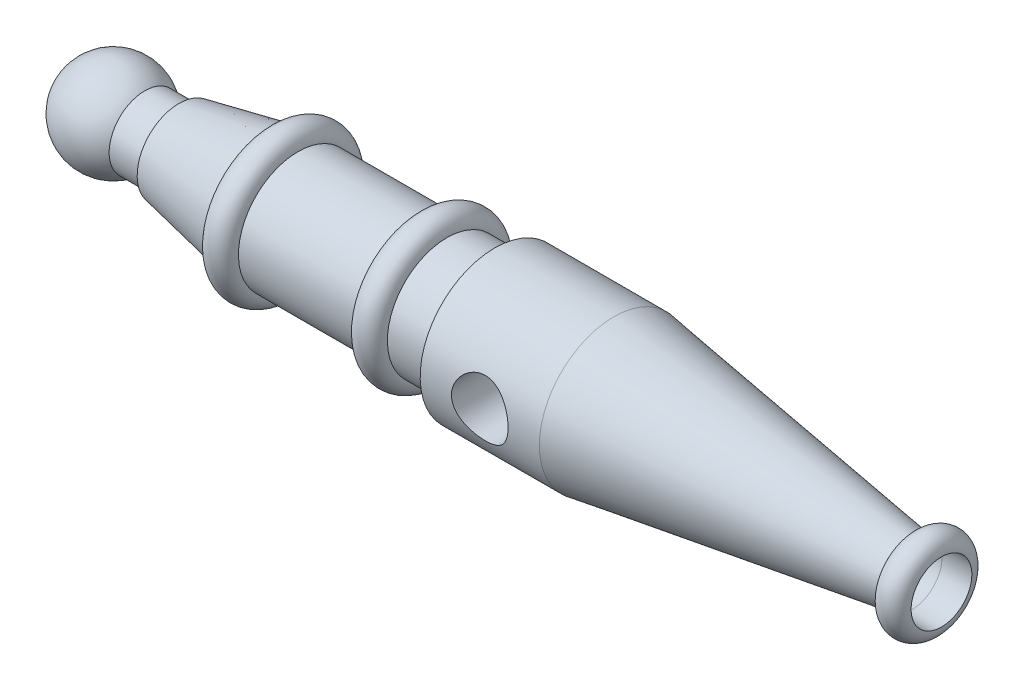
ISO-10303-21;
HEADER;
FILE_DESCRIPTION(('STEP AP214'),'2;1');
FILE_NAME('part.step','',(''),(''),'','','');
FILE_SCHEMA(('AUTOMOTIVE_DESIGN { 1 0 10303 214 1 1 1 1 }'));
ENDSEC;
DATA;
#1=APPLICATION_CONTEXT('core data for automotive mechanical design processes');
#2=APPLICATION_PROTOCOL_DEFINITION('international standard','automotive_design',2000,#1);
#3=PRODUCT_CONTEXT('',#1,'mechanical');
#4=PRODUCT('Part','Part','',(#3));
#5=PRODUCT_RELATED_PRODUCT_CATEGORY('part','',(#4));
#6=PRODUCT_DEFINITION_FORMATION('','',#4);
#7=PRODUCT_DEFINITION_CONTEXT('part definition',#1,'design');
#8=PRODUCT_DEFINITION('design','',#6,#7);
#9=PRODUCT_DEFINITION_SHAPE('','',#8);
#10=(LENGTH_UNIT() NAMED_UNIT(*) SI_UNIT(.MILLI.,.METRE.));
#11=(NAMED_UNIT(*) PLANE_ANGLE_UNIT() SI_UNIT($,.RADIAN.));
#12=(NAMED_UNIT(*) SI_UNIT($,.STERADIAN.) SOLID_ANGLE_UNIT());
#13=UNCERTAINTY_MEASURE_WITH_UNIT(LENGTH_MEASURE(1.E-05),#10,'distance_accuracy_value','');
#14=(GEOMETRIC_REPRESENTATION_CONTEXT(3) GLOBAL_UNCERTAINTY_ASSIGNED_CONTEXT((#13)) GLOBAL_UNIT_ASSIGNED_CONTEXT((#10,
#11,#12)) REPRESENTATION_CONTEXT('',''));
#15=CARTESIAN_POINT('',(0.,0.,0.));
#16=DIRECTION('',(0.,0.,1.));
#17=DIRECTION('',(1.,0.,0.));
#18=AXIS2_PLACEMENT_3D('',#15,#16,#17);
#19=CARTESIAN_POINT('',(84.,0.,0.));
#20=DIRECTION('',(-1.,0.,0.));
#21=DIRECTION('',(0.,-1.,0.));
#22=AXIS2_PLACEMENT_3D('',#19,#20,#21);
#23=CONICAL_SURFACE('',#22,12.5,0.147006349696604);
#24=CARTESIAN_POINT('',(134.,0.,0.));
#25=DIRECTION('',(-1.,0.,0.));
#26=DIRECTION('',(0.,-1.,0.));
#27=AXIS2_PLACEMENT_3D('',#24,#25,#26);
#28=CIRCLE('',#27,5.09627185653209);
#29=CARTESIAN_POINT('',(134.,-5.09627185653208,0.));
#30=VERTEX_POINT('',#29);
#31=EDGE_CURVE('E45',#30,#30,#28,.T.);
#32=ORIENTED_EDGE('',*,*,#31,.T.);
#33=EDGE_LOOP('',(#32));
#34=FACE_BOUND('',#33,.T.);
#35=CARTESIAN_POINT('',(84.,0.,0.));
#36=DIRECTION('',(1.,0.,0.));
#37=DIRECTION('',(0.,1.,0.));
#38=AXIS2_PLACEMENT_3D('',#35,#36,#37);
#39=CIRCLE('',#38,12.5);
#40=CARTESIAN_POINT('',(84.,12.5,0.));
#41=VERTEX_POINT('',#40);
#42=EDGE_CURVE('E80',#41,#41,#39,.T.);
#43=ORIENTED_EDGE('',*,*,#42,.T.);
#44=EDGE_LOOP('',(#43));
#45=FACE_BOUND('',#44,.T.);
#46=ADVANCED_FACE('F41',(#34,#45),#23,.T.);
#47=CARTESIAN_POINT('',(84.,0.,0.));
#48=DIRECTION('',(1.,0.,0.));
#49=DIRECTION('',(0.,1.,0.));
#50=AXIS2_PLACEMENT_3D('',#47,#48,#49);
#51=CYLINDRICAL_SURFACE('',#50,12.5);
#52=CARTESIAN_POINT('',(78.75,0.,-12.5));
#53=CARTESIAN_POINT('',(78.7500006745767,0.128466446938818,-12.5000005012393));
#54=CARTESIAN_POINT('',(78.7447843835891,0.256923646186465,-12.4980153397341));
#55=CARTESIAN_POINT('',(78.7239718683116,0.512917273918689,-12.4901287481548));
#56=CARTESIAN_POINT('',(78.7083723830663,0.640453400406382,-12.4842260877492));
#57=CARTESIAN_POINT('',(78.6669592815581,0.893546659172996,-12.4686664063571));
#58=CARTESIAN_POINT('',(78.6411513793594,1.0191048577656,-12.4590114857153));
#59=CARTESIAN_POINT('',(78.5795624724585,1.26747251190663,-12.436200181148));
#60=CARTESIAN_POINT('',(78.5437775905132,1.39028087873356,-12.4230424360485));
#61=CARTESIAN_POINT('',(78.4626581879778,1.63198891229308,-12.3936028937675));
#62=CARTESIAN_POINT('',(78.4173466965652,1.75089721971283,-12.3773286386007));
#63=CARTESIAN_POINT('',(78.3175104462981,1.98437662723286,-12.3420509918013));
#64=CARTESIAN_POINT('',(78.2629822702312,2.09894609929436,-12.3230465883222));
#65=CARTESIAN_POINT('',(78.0861906067839,2.4350590912118,-12.2626315047553));
#66=CARTESIAN_POINT('',(77.9506576283446,2.64919164725329,-12.2177954028037));
#67=CARTESIAN_POINT('',(77.6421647180935,3.0603754853248,-12.1214921926306));
#68=CARTESIAN_POINT('',(77.4679471463297,3.25642969187667,-12.0698341891123));
#69=CARTESIAN_POINT('',(77.0894811240755,3.61744362733619,-11.9665936986651));
#70=CARTESIAN_POINT('',(76.8852231561552,3.78239346378753,-11.9150112409209));
#71=CARTESIAN_POINT('',(76.5557982258525,4.006122592458,-11.8409250924736));
#72=CARTESIAN_POINT('',(76.4396984035638,4.07787277388982,-11.8163429144165));
#73=CARTESIAN_POINT('',(76.2014169807964,4.2112796562967,-11.7694568811461));
#74=CARTESIAN_POINT('',(76.079237849611,4.27294041244834,-11.7471521119508));
#75=CARTESIAN_POINT('',(75.8295746229439,4.38564983408058,-11.7055410175444));
#76=CARTESIAN_POINT('',(75.7020899500244,4.43669734080586,-11.6862350197976));
#77=CARTESIAN_POINT('',(75.4427815715623,4.52766449495391,-11.6512930601117));
#78=CARTESIAN_POINT('',(75.310960009087,4.56758954884961,-11.6356553156706));
#79=CARTESIAN_POINT('',(75.0494765379652,4.63449564115211,-11.6091641155722));
#80=CARTESIAN_POINT('',(74.9199517483766,4.66194478254551,-11.5981391572528));
#81=CARTESIAN_POINT('',(74.6588287577836,4.70594997128014,-11.5803540613601));
#82=CARTESIAN_POINT('',(74.5272314953245,4.72251081207375,-11.5735920471276));
#83=CARTESIAN_POINT('',(74.262979690917,4.74456721028894,-11.5645676402429));
#84=CARTESIAN_POINT('',(74.1303253224157,4.75006454691984,-11.5623045240883));
#85=CARTESIAN_POINT('',(73.8650258459362,4.74993431563228,-11.5623581029648));
#86=CARTESIAN_POINT('',(73.7323807378003,4.74430719556799,-11.5646746136269));
#87=CARTESIAN_POINT('',(73.4763796883632,4.72268848101096,-11.5735187896225));
#88=CARTESIAN_POINT('',(73.3529576417081,4.70736101442424,-11.5797764994281));
#89=CARTESIAN_POINT('',(73.1078970676873,4.6671273330671,-11.5960507398756));
#90=CARTESIAN_POINT('',(72.9862591456169,4.64221794208398,-11.6060685168763));
#91=CARTESIAN_POINT('',(72.7456470495574,4.58305985841392,-11.6295560605714));
#92=CARTESIAN_POINT('',(72.6266722011896,4.54881355976924,-11.6430249423274));
#93=CARTESIAN_POINT('',(72.3920841325886,4.47128545414174,-11.6730170411612));
#94=CARTESIAN_POINT('',(72.2764722230428,4.42800017662868,-11.6895414311263));
#95=CARTESIAN_POINT('',(71.9314541139855,4.28327874939258,-11.7436925243237));
#96=CARTESIAN_POINT('',(71.7082918670552,4.16806851082152,-11.7854405393756));
#97=CARTESIAN_POINT('',(71.2838281709439,3.90479581255148,-11.8752623575038));
#98=CARTESIAN_POINT('',(71.0825344474763,3.75672179858853,-11.9233383829602));
#99=CARTESIAN_POINT('',(70.6927138522058,3.41982015890275,-12.0244668564206));
#100=CARTESIAN_POINT('',(70.5060327032103,3.22888228789724,-12.0776335228233));
#101=CARTESIAN_POINT('',(70.1667922113442,2.81781145947519,-12.1800970946688));
#102=CARTESIAN_POINT('',(70.0142383979542,2.59767378015139,-12.2293933721733));
#103=CARTESIAN_POINT('',(69.7454580617157,2.12963147248242,-12.3195902543165));
#104=CARTESIAN_POINT('',(69.6298625315132,1.88133356641682,-12.360341317423));
#105=CARTESIAN_POINT('',(69.442701821219,1.36688022548378,-12.4277426608653));
#106=CARTESIAN_POINT('',(69.3711165380134,1.10073300558123,-12.4543993784726));
#107=CARTESIAN_POINT('',(69.2775963116468,0.573677479246099,-12.4894688884553));
#108=CARTESIAN_POINT('',(69.2531737134772,0.313270964982971,-12.4987947222216));
#109=CARTESIAN_POINT('',(69.2474089314548,-0.208057225351649,-12.5009838786683));
#110=CARTESIAN_POINT('',(69.2660568894794,-0.468978769883661,-12.4938509684776));
#111=CARTESIAN_POINT('',(69.3440243104945,-0.973077936956711,-12.4645257652524));
#112=CARTESIAN_POINT('',(69.4017007849381,-1.21654883204224,-12.4429421784921));
#113=CARTESIAN_POINT('',(69.5539115340806,-1.69017638420405,-12.38750180738));
#114=CARTESIAN_POINT('',(69.6484505969315,-1.92033130718158,-12.3536434286722));
#115=CARTESIAN_POINT('',(69.8747333967106,-2.36845004238711,-12.2757374233217));
#116=CARTESIAN_POINT('',(70.0074976777157,-2.58584961467165,-12.2314173121275));
#117=CARTESIAN_POINT('',(70.305325876665,-2.99602447185312,-12.137470264806));
#118=CARTESIAN_POINT('',(70.4704019401065,-3.18879045219183,-12.0878413363678));
#119=CARTESIAN_POINT('',(70.8396876375161,-3.55623210606137,-11.985064504796));
#120=CARTESIAN_POINT('',(71.045643205594,-3.72914496745584,-11.9318831544933));
#121=CARTESIAN_POINT('',(71.4848323542859,-4.03837087571106,-11.8308123502666));
#122=CARTESIAN_POINT('',(71.7180687431341,-4.17468014990191,-11.7829234421247));
#123=CARTESIAN_POINT('',(72.0843584962984,-4.34871299636099,-11.7193224978098));
#124=CARTESIAN_POINT('',(72.2096141625501,-4.40177044148724,-11.6994448738917));
#125=CARTESIAN_POINT('',(72.4646408130254,-4.49707330691068,-11.6631444504838));
#126=CARTESIAN_POINT('',(72.5944098412718,-4.53932334614442,-11.6467201756163));
#127=CARTESIAN_POINT('',(72.8574751261568,-4.61256770312462,-11.6179072708148));
#128=CARTESIAN_POINT('',(72.9907702460197,-4.64356560212121,-11.6055173569829));
#129=CARTESIAN_POINT('',(73.2598696831389,-4.69397900786603,-11.5852191698974));
#130=CARTESIAN_POINT('',(73.3956738180134,-4.71339535309548,-11.5773105722075));
#131=CARTESIAN_POINT('',(73.6596283033566,-4.73952098873368,-11.5666383982182));
#132=CARTESIAN_POINT('',(73.7876922426723,-4.74698436529658,-11.5635697011122));
#133=CARTESIAN_POINT('',(74.0440815536004,-4.75152604134758,-11.5617043526346));
#134=CARTESIAN_POINT('',(74.1724069987481,-4.74860084160406,-11.5629091407203));
#135=CARTESIAN_POINT('',(74.4282282305541,-4.73239263611602,-11.5695520918507));
#136=CARTESIAN_POINT('',(74.5557243830436,-4.71911456118938,-11.5749882396016));
#137=CARTESIAN_POINT('',(74.8090399859767,-4.68234374170502,-11.5899115396728));
#138=CARTESIAN_POINT('',(74.9348587865039,-4.65884714995236,-11.5994002177163));
#139=CARTESIAN_POINT('',(75.1798053115603,-4.60280569614165,-11.6217493591521));
#140=CARTESIAN_POINT('',(75.299017378433,-4.57058127757041,-11.6344896300873));
#141=CARTESIAN_POINT('',(75.534248793183,-4.49708671459059,-11.6630938751032));
#142=CARTESIAN_POINT('',(75.6502670081751,-4.45581340583947,-11.6789589417085));
#143=CARTESIAN_POINT('',(75.9924346145225,-4.31890542711458,-11.7305847438557));
#144=CARTESIAN_POINT('',(76.2128785805009,-4.21014074671157,-11.7703937023547));
#145=CARTESIAN_POINT('',(76.6445743867865,-3.95413108187677,-11.8589251576371));
#146=CARTESIAN_POINT('',(76.8547060532189,-3.80514081966397,-11.9080102201227));
#147=CARTESIAN_POINT('',(77.248057372147,-3.47540026707773,-12.0083800053119));
#148=CARTESIAN_POINT('',(77.431268320488,-3.29463974587397,-12.0596654325553));
#149=CARTESIAN_POINT('',(77.6872930924983,-2.99746860333468,-12.1357522409645));
#150=CARTESIAN_POINT('',(77.7714389736465,-2.89088551968472,-12.1616429270626));
#151=CARTESIAN_POINT('',(77.9304435680941,-2.67067948767236,-12.2118876888598));
#152=CARTESIAN_POINT('',(78.0053056656052,-2.55705912738512,-12.2362423228947));
#153=CARTESIAN_POINT('',(78.1452156714933,-2.32341236076622,-12.2827502759549));
#154=CARTESIAN_POINT('',(78.2102579035981,-2.20338230322347,-12.304902319289));
#155=CARTESIAN_POINT('',(78.3299079557418,-1.95781549313792,-12.3463538942416));
#156=CARTESIAN_POINT('',(78.3845201733574,-1.83228108895005,-12.3656546272692));
#157=CARTESIAN_POINT('',(78.4855532510238,-1.5694617753102,-12.4018279997747));
#158=CARTESIAN_POINT('',(78.5313540440669,-1.43191096979924,-12.4185073179799));
#159=CARTESIAN_POINT('',(78.6102604457606,-1.15282973759642,-12.4475159966159));
#160=CARTESIAN_POINT('',(78.6433716686955,-1.01130110064607,-12.459847280567));
#161=CARTESIAN_POINT('',(78.6965160686768,-0.725505468548199,-12.4797498090044));
#162=CARTESIAN_POINT('',(78.7165518483098,-0.58123902423101,-12.4873220007477));
#163=CARTESIAN_POINT('',(78.743292574796,-0.291310969774446,-12.4974464894756));
#164=CARTESIAN_POINT('',(78.749999235195,-0.145649541388967,-12.4999994317171));
#165=CARTESIAN_POINT('',(78.75,0.,-12.5));
#166=B_SPLINE_CURVE_WITH_KNOTS('',3,(#52,#53,#54,#55,#56,#57,#58,#59,#60,#61,#62,#63,#64,#65,
#66,#67,#68,#69,#70,#71,#72,#73,#74,#75,#76,#77,#78,#79,#80,#81,#82,#83,#84,#85,#86,#87,#88,#89,
#90,#91,#92,#93,#94,#95,#96,#97,#98,#99,#100,#101,#102,#103,#104,#105,#106,#107,#108,#109,#110,
#111,#112,#113,#114,#115,#116,#117,#118,#119,#120,#121,#122,#123,#124,#125,#126,#127,#128,#129,
#130,#131,#132,#133,#134,#135,#136,#137,#138,#139,#140,#141,#142,#143,#144,#145,#146,#147,#148,
#149,#150,#151,#152,#153,#154,#155,#156,#157,#158,#159,#160,#161,#162,#163,#164,#165),
.UNSPECIFIED.,.T.,.F.,(4,2,2,2,2,2,2,2,2,2,2,2,2,2,2,2,2,2,2,2,2,2,2,2,2,2,2,2,2,2,2,2,2,2,2,2,
2,2,2,2,2,2,2,2,2,2,2,2,2,2,2,2,2,2,2,2,4),(0.,0.385262777799974,0.770646608705619,
1.15581502924361,1.54113334265699,1.92553070033719,2.31007089250849,3.07856982350731,
3.87715861657319,4.67600096659892,5.09160537368291,5.50704232710943,5.92252461418106,
6.33780458716929,6.73586392525797,7.13374790463234,7.53156789203284,7.92937186411553,
8.30251559168308,8.67578311552742,9.04895502107775,9.42227047088334,10.1824862468386,
10.9429697244626,11.7560474568173,12.5692568328079,13.3956885513754,14.221742489313,
15.0028882340516,15.7838552054488,16.5338374469207,17.2839171374857,18.0562494365395,
18.8288726027406,19.6475421200437,20.4662959838729,20.8782711750289,21.2900699983605,
21.7017376421742,22.1133754784596,22.4978452931976,22.8824446229407,23.2668608893628,
23.6514220110902,24.0234283181465,24.3955649216571,25.139282934915,25.922731508458,
26.706432836138,27.1207428294027,27.5349013477699,27.9492983570997,28.3635202578182,
28.8006508375199,29.2375877923427,29.6744377510004,30.1112315460957),.UNSPECIFIED.);
#167=CARTESIAN_POINT('',(78.75,0.,-12.5));
#168=VERTEX_POINT('',#167);
#169=EDGE_CURVE('E83',#168,#168,#166,.T.);
#170=ORIENTED_EDGE('',*,*,#169,.T.);
#171=EDGE_LOOP('',(#170));
#172=FACE_BOUND('',#171,.T.);
#173=CARTESIAN_POINT('',(78.75,0.,12.5));
#174=CARTESIAN_POINT('',(78.7500006745767,-0.128466446938811,12.5000005012394));
#175=CARTESIAN_POINT('',(78.7447843835891,-0.256923646186459,12.4980153397341));
#176=CARTESIAN_POINT('',(78.7239718683116,-0.512917273918683,12.4901287481548));
#177=CARTESIAN_POINT('',(78.7083723830663,-0.640453400406376,12.4842260877492));
#178=CARTESIAN_POINT('',(78.6669592815581,-0.893546659172991,12.4686664063571));
#179=CARTESIAN_POINT('',(78.6411513793594,-1.0191048577656,12.4590114857153));
#180=CARTESIAN_POINT('',(78.5795624724585,-1.26747251190662,12.436200181148));
#181=CARTESIAN_POINT('',(78.5437775905132,-1.39028087873355,12.4230424360485));
#182=CARTESIAN_POINT('',(78.4626581879778,-1.63198891229307,12.3936028937675));
#183=CARTESIAN_POINT('',(78.4173466965652,-1.75089721971283,12.3773286386007));
#184=CARTESIAN_POINT('',(78.3175104462981,-1.98437662723285,12.3420509918013));
#185=CARTESIAN_POINT('',(78.2629822702312,-2.09894609929436,12.3230465883222));
#186=CARTESIAN_POINT('',(78.0861906067839,-2.4350590912118,12.2626315047553));
#187=CARTESIAN_POINT('',(77.9506576283446,-2.64919164725328,12.2177954028037));
#188=CARTESIAN_POINT('',(77.6421647180935,-3.06037548532479,12.1214921926306));
#189=CARTESIAN_POINT('',(77.4679471463297,-3.25642969187666,12.0698341891123));
#190=CARTESIAN_POINT('',(77.0894811240755,-3.61744362733618,11.9665936986651));
#191=CARTESIAN_POINT('',(76.8852231561552,-3.78239346378752,11.9150112409209));
#192=CARTESIAN_POINT('',(76.5557982258525,-4.006122592458,11.8409250924736));
#193=CARTESIAN_POINT('',(76.4396984035639,-4.07787277388981,11.8163429144165));
#194=CARTESIAN_POINT('',(76.2014169807964,-4.2112796562967,11.7694568811461));
#195=CARTESIAN_POINT('',(76.079237849611,-4.27294041244833,11.7471521119508));
#196=CARTESIAN_POINT('',(75.8295746229439,-4.38564983408058,11.7055410175444));
#197=CARTESIAN_POINT('',(75.7020899500244,-4.43669734080586,11.6862350197976));
#198=CARTESIAN_POINT('',(75.4427815715623,-4.52766449495391,11.6512930601117));
#199=CARTESIAN_POINT('',(75.310960009087,-4.56758954884961,11.6356553156706));
#200=CARTESIAN_POINT('',(75.0494765379652,-4.63449564115211,11.6091641155722));
#201=CARTESIAN_POINT('',(74.9199517483766,-4.6619447825455,11.5981391572528));
#202=CARTESIAN_POINT('',(74.6588287577836,-4.70594997128014,11.5803540613601));
#203=CARTESIAN_POINT('',(74.5272314953245,-4.72251081207375,11.5735920471276));
#204=CARTESIAN_POINT('',(74.262979690917,-4.74456721028894,11.5645676402429));
#205=CARTESIAN_POINT('',(74.1303253224157,-4.75006454691983,11.5623045240883));
#206=CARTESIAN_POINT('',(73.8650258459362,-4.74993431563228,11.5623581029648));
#207=CARTESIAN_POINT('',(73.7323807378003,-4.74430719556798,11.5646746136269));
#208=CARTESIAN_POINT('',(73.4763796883632,-4.72268848101095,11.5735187896225));
#209=CARTESIAN_POINT('',(73.3529576417081,-4.70736101442424,11.5797764994281));
#210=CARTESIAN_POINT('',(73.1078970676873,-4.6671273330671,11.5960507398756));
#211=CARTESIAN_POINT('',(72.9862591456169,-4.64221794208398,11.6060685168763));
#212=CARTESIAN_POINT('',(72.7456470495574,-4.58305985841391,11.6295560605714));
#213=CARTESIAN_POINT('',(72.6266722011896,-4.54881355976923,11.6430249423274));
#214=CARTESIAN_POINT('',(72.3920841325886,-4.47128545414173,11.6730170411612));
#215=CARTESIAN_POINT('',(72.2764722230428,-4.42800017662868,11.6895414311263));
#216=CARTESIAN_POINT('',(71.9314541139855,-4.28327874939258,11.7436925243237));
#217=CARTESIAN_POINT('',(71.7082918670552,-4.16806851082151,11.7854405393756));
#218=CARTESIAN_POINT('',(71.2838281709439,-3.90479581255147,11.8752623575038));
#219=CARTESIAN_POINT('',(71.0825344474763,-3.75672179858853,11.9233383829602));
#220=CARTESIAN_POINT('',(70.6927138522058,-3.41982015890274,12.0244668564206));
#221=CARTESIAN_POINT('',(70.5060327032103,-3.22888228789724,12.0776335228233));
#222=CARTESIAN_POINT('',(70.1667922113442,-2.81781145947519,12.1800970946688));
#223=CARTESIAN_POINT('',(70.0142383979542,-2.59767378015138,12.2293933721733));
#224=CARTESIAN_POINT('',(69.7454580617157,-2.12963147248241,12.3195902543165));
#225=CARTESIAN_POINT('',(69.6298625315132,-1.88133356641682,12.360341317423));
#226=CARTESIAN_POINT('',(69.442701821219,-1.36688022548377,12.4277426608653));
#227=CARTESIAN_POINT('',(69.3711165380134,-1.10073300558122,12.4543993784726));
#228=CARTESIAN_POINT('',(69.2775963116468,-0.573677479246094,12.4894688884553));
#229=CARTESIAN_POINT('',(69.2531737134772,-0.313270964982966,12.4987947222216));
#230=CARTESIAN_POINT('',(69.2474089314548,0.208057225351654,12.5009838786683));
#231=CARTESIAN_POINT('',(69.2660568894794,0.468978769883666,12.4938509684776));
#232=CARTESIAN_POINT('',(69.3440243104945,0.973077936956717,12.4645257652524));
#233=CARTESIAN_POINT('',(69.4017007849381,1.21654883204225,12.4429421784921));
#234=CARTESIAN_POINT('',(69.5539115340806,1.69017638420406,12.38750180738));
#235=CARTESIAN_POINT('',(69.6484505969315,1.92033130718159,12.3536434286722));
#236=CARTESIAN_POINT('',(69.8747333967106,2.36845004238712,12.2757374233217));
#237=CARTESIAN_POINT('',(70.0074976777157,2.58584961467165,12.2314173121275));
#238=CARTESIAN_POINT('',(70.305325876665,2.99602447185313,12.137470264806));
#239=CARTESIAN_POINT('',(70.4704019401065,3.18879045219183,12.0878413363678));
#240=CARTESIAN_POINT('',(70.8396876375161,3.55623210606137,11.985064504796));
#241=CARTESIAN_POINT('',(71.045643205594,3.72914496745584,11.9318831544933));
#242=CARTESIAN_POINT('',(71.4848323542859,4.03837087571106,11.8308123502666));
#243=CARTESIAN_POINT('',(71.7180687431341,4.17468014990191,11.7829234421247));
#244=CARTESIAN_POINT('',(72.0843584962984,4.348712996361,11.7193224978098));
#245=CARTESIAN_POINT('',(72.2096141625501,4.40177044148724,11.6994448738917));
#246=CARTESIAN_POINT('',(72.4646408130254,4.49707330691068,11.6631444504838));
#247=CARTESIAN_POINT('',(72.5944098412718,4.53932334614443,11.6467201756163));
#248=CARTESIAN_POINT('',(72.8574751261567,4.61256770312462,11.6179072708148));
#249=CARTESIAN_POINT('',(72.9907702460197,4.64356560212121,11.6055173569829));
#250=CARTESIAN_POINT('',(73.2598696831389,4.69397900786604,11.5852191698974));
#251=CARTESIAN_POINT('',(73.3956738180134,4.71339535309548,11.5773105722075));
#252=CARTESIAN_POINT('',(73.6596283033566,4.73952098873368,11.5666383982182));
#253=CARTESIAN_POINT('',(73.7876922426723,4.74698436529659,11.5635697011122));
#254=CARTESIAN_POINT('',(74.0440815536004,4.75152604134759,11.5617043526346));
#255=CARTESIAN_POINT('',(74.172406998748,4.74860084160407,11.5629091407203));
#256=CARTESIAN_POINT('',(74.4282282305541,4.73239263611603,11.5695520918507));
#257=CARTESIAN_POINT('',(74.5557243830436,4.71911456118938,11.5749882396016));
#258=CARTESIAN_POINT('',(74.8090399859767,4.68234374170502,11.5899115396728));
#259=CARTESIAN_POINT('',(74.9348587865039,4.65884714995237,11.5994002177163));
#260=CARTESIAN_POINT('',(75.1798053115603,4.60280569614166,11.6217493591521));
#261=CARTESIAN_POINT('',(75.299017378433,4.57058127757042,11.6344896300873));
#262=CARTESIAN_POINT('',(75.534248793183,4.4970867145906,11.6630938751032));
#263=CARTESIAN_POINT('',(75.6502670081751,4.45581340583947,11.6789589417085));
#264=CARTESIAN_POINT('',(75.9924346145224,4.31890542711459,11.7305847438557));
#265=CARTESIAN_POINT('',(76.2128785805009,4.21014074671158,11.7703937023547));
#266=CARTESIAN_POINT('',(76.6445743867865,3.95413108187677,11.8589251576371));
#267=CARTESIAN_POINT('',(76.8547060532189,3.80514081966398,11.9080102201227));
#268=CARTESIAN_POINT('',(77.248057372147,3.47540026707774,12.0083800053119));
#269=CARTESIAN_POINT('',(77.431268320488,3.29463974587398,12.0596654325553));
#270=CARTESIAN_POINT('',(77.6872930924983,2.99746860333469,12.1357522409645));
#271=CARTESIAN_POINT('',(77.7714389736465,2.89088551968472,12.1616429270626));
#272=CARTESIAN_POINT('',(77.9304435680941,2.67067948767237,12.2118876888598));
#273=CARTESIAN_POINT('',(78.0053056656052,2.55705912738512,12.2362423228946));
#274=CARTESIAN_POINT('',(78.1452156714933,2.32341236076623,12.2827502759549));
#275=CARTESIAN_POINT('',(78.2102579035981,2.20338230322348,12.304902319289));
#276=CARTESIAN_POINT('',(78.3299079557418,1.95781549313793,12.3463538942416));
#277=CARTESIAN_POINT('',(78.3845201733574,1.83228108895006,12.3656546272692));
#278=CARTESIAN_POINT('',(78.4855532510238,1.56946177531021,12.4018279997747));
#279=CARTESIAN_POINT('',(78.5313540440669,1.43191096979925,12.4185073179799));
#280=CARTESIAN_POINT('',(78.6102604457606,1.15282973759643,12.4475159966159));
#281=CARTESIAN_POINT('',(78.6433716686955,1.01130110064608,12.459847280567));
#282=CARTESIAN_POINT('',(78.6965160686768,0.725505468548206,12.4797498090044));
#283=CARTESIAN_POINT('',(78.7165518483098,0.581239024231016,12.4873220007477));
#284=CARTESIAN_POINT('',(78.743292574796,0.291310969774452,12.4974464894756));
#285=CARTESIAN_POINT('',(78.749999235195,0.145649541388973,12.4999994317171));
#286=CARTESIAN_POINT('',(78.75,0.,12.5));
#287=B_SPLINE_CURVE_WITH_KNOTS('',3,(#173,#174,#175,#176,#177,#178,#179,#180,#181,#182,#183,
#184,#185,#186,#187,#188,#189,#190,#191,#192,#193,#194,#195,#196,#197,#198,#199,#200,#201,#202,
#203,#204,#205,#206,#207,#208,#209,#210,#211,#212,#213,#214,#215,#216,#217,#218,#219,#220,#221,
#222,#223,#224,#225,#226,#227,#228,#229,#230,#231,#232,#233,#234,#235,#236,#237,#238,#239,#240,
#241,#242,#243,#244,#245,#246,#247,#248,#249,#250,#251,#252,#253,#254,#255,#256,#257,#258,#259,
#260,#261,#262,#263,#264,#265,#266,#267,#268,#269,#270,#271,#272,#273,#274,#275,#276,#277,#278,
#279,#280,#281,#282,#283,#284,#285,#286),.UNSPECIFIED.,.T.,.F.,(4,2,2,2,2,2,2,2,2,2,2,2,2,2,2,2,
2,2,2,2,2,2,2,2,2,2,2,2,2,2,2,2,2,2,2,2,2,2,2,2,2,2,2,2,2,2,2,2,2,2,2,2,2,2,2,2,4),(0.,
0.385262777799973,0.770646608705619,1.15581502924361,1.541133342657,1.92553070033718,
2.31007089250849,3.07856982350731,3.87715861657319,4.67600096659892,5.0916053736829,
5.50704232710944,5.92252461418107,6.33780458716929,6.73586392525797,7.13374790463234,
7.53156789203284,7.92937186411553,8.30251559168308,8.67578311552742,9.04895502107775,
9.42227047088334,10.1824862468386,10.9429697244626,11.7560474568173,12.5692568328079,
13.3956885513754,14.221742489313,15.0028882340516,15.7838552054488,16.5338374469207,
17.2839171374857,18.0562494365395,18.8288726027406,19.6475421200437,20.4662959838729,
20.8782711750289,21.2900699983605,21.7017376421742,22.1133754784596,22.4978452931977,
22.8824446229406,23.2668608893628,23.6514220110902,24.0234283181465,24.3955649216571,
25.139282934915,25.922731508458,26.706432836138,27.1207428294027,27.5349013477699,
27.9492983570997,28.3635202578182,28.8006508375199,29.2375877923427,29.6744377510004,
30.1112315460957),.UNSPECIFIED.);
#288=CARTESIAN_POINT('',(78.75,0.,12.5));
#289=VERTEX_POINT('',#288);
#290=EDGE_CURVE('E79',#289,#289,#287,.T.);
#291=ORIENTED_EDGE('',*,*,#290,.T.);
#292=EDGE_LOOP('',(#291));
#293=FACE_BOUND('',#292,.T.);
#294=ORIENTED_EDGE('',*,*,#42,.F.);
#295=EDGE_LOOP('',(#294));
#296=FACE_BOUND('',#295,.T.);
#297=CARTESIAN_POINT('',(64.,0.,0.));
#298=DIRECTION('',(1.,0.,0.));
#299=DIRECTION('',(0.,1.,0.));
#300=AXIS2_PLACEMENT_3D('',#297,#298,#299);
#301=CIRCLE('',#300,12.5);
#302=CARTESIAN_POINT('',(64.,12.5,0.));
#303=VERTEX_POINT('',#302);
#304=EDGE_CURVE('E76',#303,#303,#301,.T.);
#305=ORIENTED_EDGE('',*,*,#304,.T.);
#306=EDGE_LOOP('',(#305));
#307=FACE_BOUND('',#306,.T.);
#308=ADVANCED_FACE('F94',(#172,#293,#296,#307),#51,.T.);
#309=CARTESIAN_POINT('',(64.,0.,0.));
#310=DIRECTION('',(-1.,0.,0.));
#311=DIRECTION('',(0.,-1.,0.));
#312=AXIS2_PLACEMENT_3D('',#309,#310,#311);
#313=PLANE('',#312);
#314=CARTESIAN_POINT('',(64.,0.,0.));
#315=DIRECTION('',(1.,0.,0.));
#316=DIRECTION('',(0.,1.,0.));
#317=AXIS2_PLACEMENT_3D('',#314,#315,#316);
#318=CIRCLE('',#317,10.);
#319=CARTESIAN_POINT('',(64.,10.,0.));
#320=VERTEX_POINT('',#319);
#321=EDGE_CURVE('E73',#320,#320,#318,.T.);
#322=ORIENTED_EDGE('',*,*,#321,.T.);
#323=EDGE_LOOP('',(#322));
#324=FACE_BOUND('',#323,.T.);
#325=ORIENTED_EDGE('',*,*,#304,.F.);
#326=EDGE_LOOP('',(#325));
#327=FACE_BOUND('',#326,.T.);
#328=ADVANCED_FACE('F117',(#324,#327),#313,.T.);
#329=CARTESIAN_POINT('',(84.,0.,0.));
#330=DIRECTION('',(1.,0.,0.));
#331=DIRECTION('',(0.,1.,0.));
#332=AXIS2_PLACEMENT_3D('',#329,#330,#331);
#333=CYLINDRICAL_SURFACE('',#332,10.);
#334=ORIENTED_EDGE('',*,*,#321,.F.);
#335=EDGE_LOOP('',(#334));
#336=FACE_BOUND('',#335,.T.);
#337=CARTESIAN_POINT('',(56.,0.,0.));
#338=DIRECTION('',(1.,0.,0.));
#339=DIRECTION('',(0.,1.,0.));
#340=AXIS2_PLACEMENT_3D('',#337,#338,#339);
#341=CIRCLE('',#340,10.);
#342=CARTESIAN_POINT('',(56.,10.,0.));
#343=VERTEX_POINT('',#342);
#344=EDGE_CURVE('E70',#343,#343,#341,.T.);
#345=ORIENTED_EDGE('',*,*,#344,.T.);
#346=EDGE_LOOP('',(#345));
#347=FACE_BOUND('',#346,.T.);
#348=ADVANCED_FACE('F128',(#336,#347),#333,.T.);
#349=CARTESIAN_POINT('',(53.5,0.,0.));
#350=DIRECTION('',(1.,0.,0.));
#351=DIRECTION('',(0.,1.,0.));
#352=AXIS2_PLACEMENT_3D('',#349,#350,#351);
#353=TOROIDAL_SURFACE('',#352,10.,2.5);
#354=ORIENTED_EDGE('',*,*,#344,.F.);
#355=EDGE_LOOP('',(#354));
#356=FACE_BOUND('',#355,.T.);
#357=CARTESIAN_POINT('',(51.,0.,0.));
#358=DIRECTION('',(1.,0.,0.));
#359=DIRECTION('',(0.,1.,0.));
#360=AXIS2_PLACEMENT_3D('',#357,#358,#359);
#361=CIRCLE('',#360,10.);
#362=CARTESIAN_POINT('',(51.,10.,0.));
#363=VERTEX_POINT('',#362);
#364=EDGE_CURVE('E67',#363,#363,#361,.T.);
#365=ORIENTED_EDGE('',*,*,#364,.T.);
#366=EDGE_LOOP('',(#365));
#367=FACE_BOUND('',#366,.T.);
#368=ADVANCED_FACE('F133',(#356,#367),#353,.T.);
#369=CARTESIAN_POINT('',(84.,0.,0.));
#370=DIRECTION('',(1.,0.,0.));
#371=DIRECTION('',(0.,1.,0.));
#372=AXIS2_PLACEMENT_3D('',#369,#370,#371);
#373=CYLINDRICAL_SURFACE('',#372,10.);
#374=ORIENTED_EDGE('',*,*,#364,.F.);
#375=EDGE_LOOP('',(#374));
#376=FACE_BOUND('',#375,.T.);
#377=CARTESIAN_POINT('',(31.,0.,0.));
#378=DIRECTION('',(1.,0.,0.));
#379=DIRECTION('',(0.,1.,0.));
#380=AXIS2_PLACEMENT_3D('',#377,#378,#379);
#381=CIRCLE('',#380,10.);
#382=CARTESIAN_POINT('',(31.,10.,0.));
#383=VERTEX_POINT('',#382);
#384=EDGE_CURVE('E64',#383,#383,#381,.T.);
#385=ORIENTED_EDGE('',*,*,#384,.T.);
#386=EDGE_LOOP('',(#385));
#387=FACE_BOUND('',#386,.T.);
#388=ADVANCED_FACE('F139',(#376,#387),#373,.T.);
#389=CARTESIAN_POINT('',(28.5,0.,0.));
#390=DIRECTION('',(1.,0.,0.));
#391=DIRECTION('',(0.,1.,0.));
#392=AXIS2_PLACEMENT_3D('',#389,#390,#391);
#393=TOROIDAL_SURFACE('',#392,10.,2.5);
#394=ORIENTED_EDGE('',*,*,#384,.F.);
#395=EDGE_LOOP('',(#394));
#396=FACE_BOUND('',#395,.T.);
#397=CARTESIAN_POINT('',(26.,0.,0.));
#398=DIRECTION('',(1.,0.,0.));
#399=DIRECTION('',(0.,1.,0.));
#400=AXIS2_PLACEMENT_3D('',#397,#398,#399);
#401=CIRCLE('',#400,10.);
#402=CARTESIAN_POINT('',(26.,10.,0.));
#403=VERTEX_POINT('',#402);
#404=EDGE_CURVE('E61',#403,#403,#401,.T.);
#405=ORIENTED_EDGE('',*,*,#404,.T.);
#406=EDGE_LOOP('',(#405));
#407=FACE_BOUND('',#406,.T.);
#408=ADVANCED_FACE('F143',(#396,#407),#393,.T.);
#409=CARTESIAN_POINT('',(11.,0.,0.));
#410=DIRECTION('',(1.,0.,0.));
#411=DIRECTION('',(0.,1.,0.));
#412=AXIS2_PLACEMENT_3D('',#409,#410,#411);
#413=CONICAL_SURFACE('',#412,7.,0.197395559849881);
#414=ORIENTED_EDGE('',*,*,#404,.F.);
#415=EDGE_LOOP('',(#414));
#416=FACE_BOUND('',#415,.T.);
#417=CARTESIAN_POINT('',(11.,0.,0.));
#418=DIRECTION('',(1.,0.,0.));
#419=DIRECTION('',(0.,1.,0.));
#420=AXIS2_PLACEMENT_3D('',#417,#418,#419);
#421=CIRCLE('',#420,7.);
#422=CARTESIAN_POINT('',(11.,7.,0.));
#423=VERTEX_POINT('',#422);
#424=EDGE_CURVE('E58',#423,#423,#421,.T.);
#425=ORIENTED_EDGE('',*,*,#424,.T.);
#426=EDGE_LOOP('',(#425));
#427=FACE_BOUND('',#426,.T.);
#428=ADVANCED_FACE('F147',(#416,#427),#413,.T.);
#429=CARTESIAN_POINT('',(11.,0.,0.));
#430=DIRECTION('',(1.,0.,0.));
#431=DIRECTION('',(0.,1.,0.));
#432=AXIS2_PLACEMENT_3D('',#429,#430,#431);
#433=PLANE('',#432);
#434=ORIENTED_EDGE('',*,*,#424,.F.);
#435=EDGE_LOOP('',(#434));
#436=FACE_BOUND('',#435,.T.);
#437=CARTESIAN_POINT('',(11.,0.,0.));
#438=DIRECTION('',(1.,0.,0.));
#439=DIRECTION('',(0.,1.,0.));
#440=AXIS2_PLACEMENT_3D('',#437,#438,#439);
#441=CIRCLE('',#440,6.);
#442=CARTESIAN_POINT('',(11.,6.,0.));
#443=VERTEX_POINT('',#442);
#444=EDGE_CURVE('E53',#443,#443,#441,.T.);
#445=ORIENTED_EDGE('',*,*,#444,.T.);
#446=EDGE_LOOP('',(#445));
#447=FACE_BOUND('',#446,.T.);
#448=ADVANCED_FACE('F151',(#436,#447),#433,.F.);
#449=CARTESIAN_POINT('',(84.,0.,0.));
#450=DIRECTION('',(1.,0.,0.));
#451=DIRECTION('',(0.,1.,0.));
#452=AXIS2_PLACEMENT_3D('',#449,#450,#451);
#453=CYLINDRICAL_SURFACE('',#452,6.00000000000001);
#454=ORIENTED_EDGE('',*,*,#444,.F.);
#455=EDGE_LOOP('',(#454));
#456=FACE_BOUND('',#455,.T.);
#457=CARTESIAN_POINT('',(5.29150262212918,0.,0.));
#458=DIRECTION('',(1.,0.,0.));
#459=DIRECTION('',(0.,1.,0.));
#460=AXIS2_PLACEMENT_3D('',#457,#458,#459);
#461=CIRCLE('',#460,6.00000000000001);
#462=CARTESIAN_POINT('',(5.29150262212918,6.,0.));
#463=VERTEX_POINT('',#462);
#464=EDGE_CURVE('E49',#463,#463,#461,.T.);
#465=ORIENTED_EDGE('',*,*,#464,.T.);
#466=EDGE_LOOP('',(#465));
#467=FACE_BOUND('',#466,.T.);
#468=ADVANCED_FACE('F154',(#456,#467),#453,.T.);
#469=CARTESIAN_POINT('',(0.,0.,0.));
#470=DIRECTION('',(1.,0.,0.));
#471=DIRECTION('',(0.,1.,0.));
#472=AXIS2_PLACEMENT_3D('',#469,#470,#471);
#473=SPHERICAL_SURFACE('',#472,8.);
#474=ORIENTED_EDGE('',*,*,#464,.F.);
#475=EDGE_LOOP('',(#474));
#476=FACE_BOUND('',#475,.T.);
#477=ADVANCED_FACE('F102',(#476),#473,.T.);
#478=CARTESIAN_POINT('',(74.,0.,-12.5));
#479=DIRECTION('',(0.,0.,1.));
#480=DIRECTION('',(1.,0.,0.));
#481=AXIS2_PLACEMENT_3D('',#478,#479,#480);
#482=CYLINDRICAL_SURFACE('',#481,4.75);
#483=ORIENTED_EDGE('',*,*,#290,.F.);
#484=EDGE_LOOP('',(#483));
#485=FACE_BOUND('',#484,.T.);
#486=ORIENTED_EDGE('',*,*,#169,.F.);
#487=EDGE_LOOP('',(#486));
#488=FACE_BOUND('',#487,.T.);
#489=ADVANCED_FACE('F98',(#485,#488),#482,.F.);
#490=CARTESIAN_POINT('',(89.,0.,0.));
#491=DIRECTION('',(1.,0.,0.));
#492=DIRECTION('',(0.,1.,0.));
#493=AXIS2_PLACEMENT_3D('',#490,#491,#492);
#494=CYLINDRICAL_SURFACE('',#493,5.09627185653209);
#495=CARTESIAN_POINT('',(89.,0.,0.));
#496=DIRECTION('',(1.,0.,0.));
#497=DIRECTION('',(0.,1.,0.));
#498=AXIS2_PLACEMENT_3D('',#495,#496,#497);
#499=CIRCLE('',#498,5.09627185653209);
#500=CARTESIAN_POINT('',(89.,5.0962718565321,0.));
#501=VERTEX_POINT('',#500);
#502=EDGE_CURVE('E11',#501,#501,#499,.T.);
#503=ORIENTED_EDGE('',*,*,#502,.F.);
#504=EDGE_LOOP('',(#503));
#505=FACE_BOUND('',#504,.T.);
#506=ORIENTED_EDGE('',*,*,#31,.F.);
#507=EDGE_LOOP('',(#506));
#508=FACE_BOUND('',#507,.T.);
#509=ADVANCED_FACE('F43',(#505,#508),#494,.F.);
#510=CARTESIAN_POINT('',(89.,0.,0.));
#511=DIRECTION('',(1.,0.,0.));
#512=DIRECTION('',(0.,1.,0.));
#513=AXIS2_PLACEMENT_3D('',#510,#511,#512);
#514=PLANE('',#513);
#515=ORIENTED_EDGE('',*,*,#502,.T.);
#516=EDGE_LOOP('',(#515));
#517=FACE_BOUND('',#516,.T.);
#518=ADVANCED_FACE('F105',(#517),#514,.T.);
#519=CLOSED_SHELL('',(#46,#308,#328,#348,#368,#388,#408,#428,#448,#468,#477,#489,#509,#518));
#520=MANIFOLD_SOLID_BREP('B2',#519);
#521=CARTESIAN_POINT('',(136.5,0.,0.));
#522=DIRECTION('',(1.,0.,0.));
#523=DIRECTION('',(0.,1.,0.));
#524=AXIS2_PLACEMENT_3D('',#521,#522,#523);
#525=TOROIDAL_SURFACE('',#524,5.0962718565321,2.5);
#526=CARTESIAN_POINT('',(139.,0.,0.));
#527=DIRECTION('',(1.,0.,0.));
#528=DIRECTION('',(0.,1.,0.));
#529=AXIS2_PLACEMENT_3D('',#526,#527,#528);
#530=CIRCLE('',#529,5.09627185653209);
#531=CARTESIAN_POINT('',(139.,5.09627185653211,0.));
#532=VERTEX_POINT('',#531);
#533=EDGE_CURVE('E272',#532,#532,#530,.T.);
#534=ORIENTED_EDGE('',*,*,#533,.F.);
#535=EDGE_LOOP('',(#534));
#536=FACE_BOUND('',#535,.T.);
#537=CARTESIAN_POINT('',(134.,0.,0.));
#538=DIRECTION('',(-1.,0.,0.));
#539=DIRECTION('',(0.,-1.,0.));
#540=AXIS2_PLACEMENT_3D('',#537,#538,#539);
#541=CIRCLE('',#540,5.09627185653209);
#542=CARTESIAN_POINT('',(134.,-5.09627185653208,0.));
#543=VERTEX_POINT('',#542);
#544=EDGE_CURVE('E40',#543,#543,#541,.T.);
#545=ORIENTED_EDGE('',*,*,#544,.F.);
#546=EDGE_LOOP('',(#545));
#547=FACE_BOUND('',#546,.T.);
#548=ADVANCED_FACE('F266',(#536,#547),#525,.T.);
#549=CARTESIAN_POINT('',(89.,0.,0.));
#550=DIRECTION('',(1.,0.,0.));
#551=DIRECTION('',(0.,1.,0.));
#552=AXIS2_PLACEMENT_3D('',#549,#550,#551);
#553=CYLINDRICAL_SURFACE('',#552,5.09627185653209);
#554=ORIENTED_EDGE('',*,*,#544,.T.);
#555=EDGE_LOOP('',(#554));
#556=FACE_BOUND('',#555,.T.);
#557=ORIENTED_EDGE('',*,*,#533,.T.);
#558=EDGE_LOOP('',(#557));
#559=FACE_BOUND('',#558,.T.);
#560=ADVANCED_FACE('F278',(#556,#559),#553,.F.);
#561=CLOSED_SHELL('',(#548,#560));
#562=MANIFOLD_SOLID_BREP('B6',#561);
#563=ADVANCED_BREP_SHAPE_REPRESENTATION('',(#18,#520,#562),#14);
#564=SHAPE_DEFINITION_REPRESENTATION(#9,#563);
ENDSEC;
END-ISO-10303-21;
